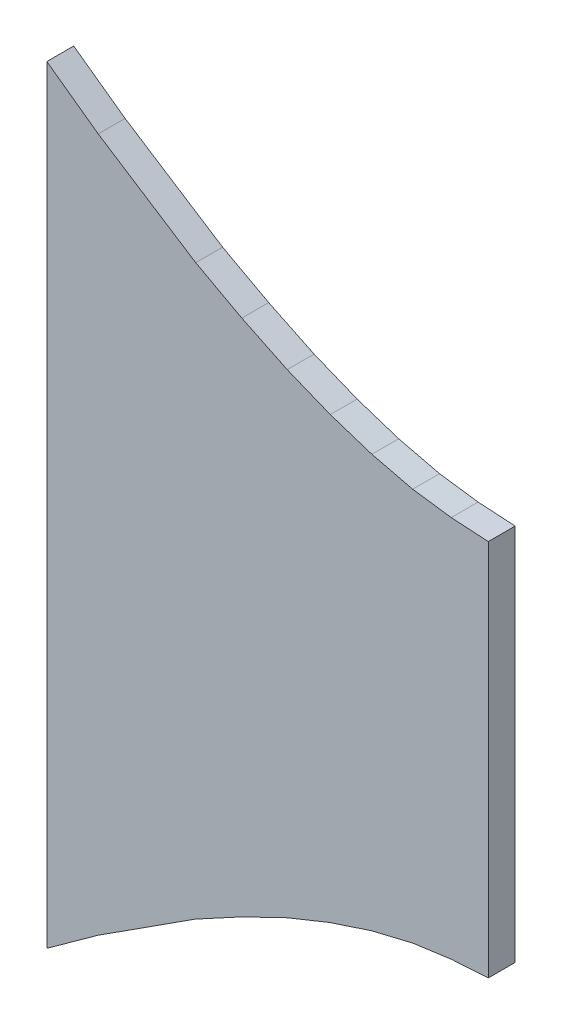
ISO-10303-21;
HEADER;
FILE_DESCRIPTION(('STEP AP214'),'2;1');
FILE_NAME('part.step','',(''),(''),'','','');
FILE_SCHEMA(('AUTOMOTIVE_DESIGN { 1 0 10303 214 1 1 1 1 }'));
ENDSEC;
DATA;
#1=APPLICATION_CONTEXT('core data for automotive mechanical design processes');
#2=APPLICATION_PROTOCOL_DEFINITION('international standard','automotive_design',2000,#1);
#3=PRODUCT_CONTEXT('',#1,'mechanical');
#4=PRODUCT('Part','Part','',(#3));
#5=PRODUCT_RELATED_PRODUCT_CATEGORY('part','',(#4));
#6=PRODUCT_DEFINITION_FORMATION('','',#4);
#7=PRODUCT_DEFINITION_CONTEXT('part definition',#1,'design');
#8=PRODUCT_DEFINITION('design','',#6,#7);
#9=PRODUCT_DEFINITION_SHAPE('','',#8);
#10=(LENGTH_UNIT() NAMED_UNIT(*) SI_UNIT(.MILLI.,.METRE.));
#11=(NAMED_UNIT(*) PLANE_ANGLE_UNIT() SI_UNIT($,.RADIAN.));
#12=(NAMED_UNIT(*) SI_UNIT($,.STERADIAN.) SOLID_ANGLE_UNIT());
#13=UNCERTAINTY_MEASURE_WITH_UNIT(LENGTH_MEASURE(1.E-05),#10,'distance_accuracy_value','');
#14=(GEOMETRIC_REPRESENTATION_CONTEXT(3) GLOBAL_UNCERTAINTY_ASSIGNED_CONTEXT((#13)) GLOBAL_UNIT_ASSIGNED_CONTEXT((#10,
#11,#12)) REPRESENTATION_CONTEXT('',''));
#15=CARTESIAN_POINT('',(0.,0.,0.));
#16=DIRECTION('',(0.,0.,1.));
#17=DIRECTION('',(1.,0.,0.));
#18=AXIS2_PLACEMENT_3D('',#15,#16,#17);
#19=CARTESIAN_POINT('',(54.8650016784668,71.75,0.));
#20=DIRECTION('',(-0.0610768850575718,-0.998133064331437,0.));
#21=DIRECTION('',(-0.998133064331437,0.0610768850575718,0.));
#22=AXIS2_PLACEMENT_3D('',#19,#20,#21);
#23=PLANE('',#22);
#24=DIRECTION('',(-0.998133064331437,0.0610768850575718,0.));
#25=VECTOR('',#24,1.);
#26=CARTESIAN_POINT('',(54.8650016784668,71.75,0.03556));
#27=LINE('',#26,#25);
#28=CARTESIAN_POINT('',(54.8650016784668,71.75,0.03556));
#29=VERTEX_POINT('',#28);
#30=CARTESIAN_POINT('',(54.8160018920898,71.7529983520508,0.03556));
#31=VERTEX_POINT('',#30);
#32=EDGE_CURVE('E11',#29,#31,#27,.T.);
#33=ORIENTED_EDGE('',*,*,#32,.F.);
#34=DIRECTION('',(0.,0.,1.));
#35=VECTOR('',#34,1.);
#36=CARTESIAN_POINT('',(54.8650016784668,71.75,0.));
#37=LINE('',#36,#35);
#38=CARTESIAN_POINT('',(54.8650016784668,71.75,0.));
#39=VERTEX_POINT('',#38);
#40=EDGE_CURVE('E24',#39,#29,#37,.T.);
#41=ORIENTED_EDGE('',*,*,#40,.F.);
#42=DIRECTION('',(-0.998133064331437,0.0610768850575718,0.));
#43=VECTOR('',#42,1.);
#44=CARTESIAN_POINT('',(54.8650016784668,71.75,0.));
#45=LINE('',#44,#43);
#46=CARTESIAN_POINT('',(54.8160018920898,71.7529983520508,0.));
#47=VERTEX_POINT('',#46);
#48=EDGE_CURVE('E172',#39,#47,#45,.T.);
#49=ORIENTED_EDGE('',*,*,#48,.T.);
#50=DIRECTION('',(0.,0.,1.));
#51=VECTOR('',#50,1.);
#52=CARTESIAN_POINT('',(54.8160018920898,71.7529983520508,0.));
#53=LINE('',#52,#51);
#54=EDGE_CURVE('E37',#47,#31,#53,.T.);
#55=ORIENTED_EDGE('',*,*,#54,.T.);
#56=EDGE_LOOP('',(#33,#41,#49,#55));
#57=FACE_BOUND('',#56,.T.);
#58=ADVANCED_FACE('F17',(#57),#23,.F.);
#59=CARTESIAN_POINT('',(54.8160018920898,71.7529983520508,0.));
#60=DIRECTION('',(-0.136045618948407,-0.990702573714707,0.));
#61=DIRECTION('',(-0.990702573714707,0.136045618948407,0.));
#62=AXIS2_PLACEMENT_3D('',#59,#60,#61);
#63=PLANE('',#62);
#64=DIRECTION('',(-0.990702573714707,0.136045618948407,0.));
#65=VECTOR('',#64,1.);
#66=CARTESIAN_POINT('',(54.8160018920898,71.7529983520508,0.03556));
#67=LINE('',#66,#65);
#68=CARTESIAN_POINT('',(54.7649993896484,71.7600021362305,0.03556));
#69=VERTEX_POINT('',#68);
#70=EDGE_CURVE('E308',#31,#69,#67,.T.);
#71=ORIENTED_EDGE('',*,*,#70,.F.);
#72=ORIENTED_EDGE('',*,*,#54,.F.);
#73=DIRECTION('',(-0.990702573714707,0.136045618948407,0.));
#74=VECTOR('',#73,1.);
#75=CARTESIAN_POINT('',(54.8160018920898,71.7529983520508,0.));
#76=LINE('',#75,#74);
#77=CARTESIAN_POINT('',(54.7649993896484,71.7600021362305,0.));
#78=VERTEX_POINT('',#77);
#79=EDGE_CURVE('E305',#47,#78,#76,.T.);
#80=ORIENTED_EDGE('',*,*,#79,.T.);
#81=DIRECTION('',(0.,0.,1.));
#82=VECTOR('',#81,1.);
#83=CARTESIAN_POINT('',(54.7649993896484,71.7600021362305,0.));
#84=LINE('',#83,#82);
#85=EDGE_CURVE('E303',#78,#69,#84,.T.);
#86=ORIENTED_EDGE('',*,*,#85,.T.);
#87=EDGE_LOOP('',(#71,#72,#80,#86));
#88=FACE_BOUND('',#87,.T.);
#89=ADVANCED_FACE('F316',(#88),#63,.F.);
#90=CARTESIAN_POINT('',(54.7649993896484,71.7600021362305,0.));
#91=DIRECTION('',(-0.234058647227909,-0.972222479506538,0.));
#92=DIRECTION('',(-0.972222479506538,0.234058647227909,0.));
#93=AXIS2_PLACEMENT_3D('',#90,#91,#92);
#94=PLANE('',#93);
#95=DIRECTION('',(-0.972222479506538,0.234058647227909,0.));
#96=VECTOR('',#95,1.);
#97=CARTESIAN_POINT('',(54.7649993896484,71.7600021362305,0.03556));
#98=LINE('',#97,#96);
#99=CARTESIAN_POINT('',(54.7109985351562,71.7730026245117,0.03556));
#100=VERTEX_POINT('',#99);
#101=EDGE_CURVE('E300',#69,#100,#98,.T.);
#102=ORIENTED_EDGE('',*,*,#101,.F.);
#103=ORIENTED_EDGE('',*,*,#85,.F.);
#104=DIRECTION('',(-0.972222479506538,0.234058647227909,0.));
#105=VECTOR('',#104,1.);
#106=CARTESIAN_POINT('',(54.7649993896484,71.7600021362305,0.));
#107=LINE('',#106,#105);
#108=CARTESIAN_POINT('',(54.7109985351562,71.7730026245117,0.));
#109=VERTEX_POINT('',#108);
#110=EDGE_CURVE('E297',#78,#109,#107,.T.);
#111=ORIENTED_EDGE('',*,*,#110,.T.);
#112=DIRECTION('',(0.,0.,1.));
#113=VECTOR('',#112,1.);
#114=CARTESIAN_POINT('',(54.7109985351562,71.7730026245117,0.));
#115=LINE('',#114,#113);
#116=EDGE_CURVE('E295',#109,#100,#115,.T.);
#117=ORIENTED_EDGE('',*,*,#116,.T.);
#118=EDGE_LOOP('',(#102,#103,#111,#117));
#119=FACE_BOUND('',#118,.T.);
#120=ADVANCED_FACE('F322',(#119),#94,.F.);
#121=CARTESIAN_POINT('',(54.7109985351562,71.7730026245117,0.));
#122=DIRECTION('',(-0.311002253042668,-0.950409174304617,0.));
#123=DIRECTION('',(-0.950409174304617,0.311002253042668,0.));
#124=AXIS2_PLACEMENT_3D('',#121,#122,#123);
#125=PLANE('',#124);
#126=DIRECTION('',(-0.950409174304617,0.311002253042668,0.));
#127=VECTOR('',#126,1.);
#128=CARTESIAN_POINT('',(54.7109985351562,71.7730026245117,0.03556));
#129=LINE('',#128,#127);
#130=CARTESIAN_POINT('',(54.6559982299805,71.7910003662109,0.03556));
#131=VERTEX_POINT('',#130);
#132=EDGE_CURVE('E292',#100,#131,#129,.T.);
#133=ORIENTED_EDGE('',*,*,#132,.F.);
#134=ORIENTED_EDGE('',*,*,#116,.F.);
#135=DIRECTION('',(-0.950409174304617,0.311002253042668,0.));
#136=VECTOR('',#135,1.);
#137=CARTESIAN_POINT('',(54.7109985351562,71.7730026245117,0.));
#138=LINE('',#137,#136);
#139=CARTESIAN_POINT('',(54.6559982299805,71.7910003662109,0.));
#140=VERTEX_POINT('',#139);
#141=EDGE_CURVE('E289',#109,#140,#138,.T.);
#142=ORIENTED_EDGE('',*,*,#141,.T.);
#143=DIRECTION('',(0.,0.,1.));
#144=VECTOR('',#143,1.);
#145=CARTESIAN_POINT('',(54.6559982299805,71.7910003662109,0.));
#146=LINE('',#145,#144);
#147=EDGE_CURVE('E287',#140,#131,#146,.T.);
#148=ORIENTED_EDGE('',*,*,#147,.T.);
#149=EDGE_LOOP('',(#133,#134,#142,#148));
#150=FACE_BOUND('',#149,.T.);
#151=ADVANCED_FACE('F324',(#150),#125,.F.);
#152=CARTESIAN_POINT('',(54.6559982299805,71.7910003662109,0.));
#153=DIRECTION('',(-0.374235233417141,-0.927333807250236,0.));
#154=DIRECTION('',(-0.927333807250236,0.374235233417141,0.));
#155=AXIS2_PLACEMENT_3D('',#152,#153,#154);
#156=PLANE('',#155);
#157=DIRECTION('',(-0.927333807250236,0.374235233417141,0.));
#158=VECTOR('',#157,1.);
#159=CARTESIAN_POINT('',(54.6559982299805,71.7910003662109,0.03556));
#160=LINE('',#159,#158);
#161=CARTESIAN_POINT('',(54.5989990234375,71.8140029907227,0.03556));
#162=VERTEX_POINT('',#161);
#163=EDGE_CURVE('E284',#131,#162,#160,.T.);
#164=ORIENTED_EDGE('',*,*,#163,.F.);
#165=ORIENTED_EDGE('',*,*,#147,.F.);
#166=DIRECTION('',(-0.927333807250236,0.374235233417141,0.));
#167=VECTOR('',#166,1.);
#168=CARTESIAN_POINT('',(54.6559982299805,71.7910003662109,0.));
#169=LINE('',#168,#167);
#170=CARTESIAN_POINT('',(54.5989990234375,71.8140029907227,0.));
#171=VERTEX_POINT('',#170);
#172=EDGE_CURVE('E281',#140,#171,#169,.T.);
#173=ORIENTED_EDGE('',*,*,#172,.T.);
#174=DIRECTION('',(0.,0.,1.));
#175=VECTOR('',#174,1.);
#176=CARTESIAN_POINT('',(54.5989990234375,71.8140029907227,0.));
#177=LINE('',#176,#175);
#178=EDGE_CURVE('E279',#171,#162,#177,.T.);
#179=ORIENTED_EDGE('',*,*,#178,.T.);
#180=EDGE_LOOP('',(#164,#165,#173,#179));
#181=FACE_BOUND('',#180,.T.);
#182=ADVANCED_FACE('F329',(#181),#156,.F.);
#183=CARTESIAN_POINT('',(54.5989990234375,71.8140029907227,0.));
#184=DIRECTION('',(-0.435174847761771,-0.900345962325327,0.));
#185=DIRECTION('',(-0.900345962325327,0.435174847761771,0.));
#186=AXIS2_PLACEMENT_3D('',#183,#184,#185);
#187=PLANE('',#186);
#188=DIRECTION('',(-0.900345962325327,0.435174847761771,0.));
#189=VECTOR('',#188,1.);
#190=CARTESIAN_POINT('',(54.5989990234375,71.8140029907227,0.03556));
#191=LINE('',#190,#189);
#192=CARTESIAN_POINT('',(54.5390014648438,71.8430023193359,0.03556));
#193=VERTEX_POINT('',#192);
#194=EDGE_CURVE('E276',#162,#193,#191,.T.);
#195=ORIENTED_EDGE('',*,*,#194,.F.);
#196=ORIENTED_EDGE('',*,*,#178,.F.);
#197=DIRECTION('',(-0.900345962325327,0.435174847761771,0.));
#198=VECTOR('',#197,1.);
#199=CARTESIAN_POINT('',(54.5989990234375,71.8140029907227,0.));
#200=LINE('',#199,#198);
#201=CARTESIAN_POINT('',(54.5390014648438,71.8430023193359,0.));
#202=VERTEX_POINT('',#201);
#203=EDGE_CURVE('E273',#171,#202,#200,.T.);
#204=ORIENTED_EDGE('',*,*,#203,.T.);
#205=DIRECTION('',(0.,0.,1.));
#206=VECTOR('',#205,1.);
#207=CARTESIAN_POINT('',(54.5390014648438,71.8430023193359,0.));
#208=LINE('',#207,#206);
#209=EDGE_CURVE('E271',#202,#193,#208,.T.);
#210=ORIENTED_EDGE('',*,*,#209,.T.);
#211=EDGE_LOOP('',(#195,#196,#204,#210));
#212=FACE_BOUND('',#211,.T.);
#213=ADVANCED_FACE('F332',(#212),#187,.F.);
#214=CARTESIAN_POINT('',(54.5390014648438,71.8430023193359,0.));
#215=DIRECTION('',(-0.475781614948567,-0.879563445623415,0.));
#216=DIRECTION('',(-0.879563445623415,0.475781614948567,0.));
#217=AXIS2_PLACEMENT_3D('',#214,#215,#216);
#218=PLANE('',#217);
#219=DIRECTION('',(-0.879563445623415,0.475781614948567,0.));
#220=VECTOR('',#219,1.);
#221=CARTESIAN_POINT('',(54.5390014648438,71.8430023193359,0.03556));
#222=LINE('',#221,#220);
#223=CARTESIAN_POINT('',(54.4780006408691,71.8759994506836,0.03556));
#224=VERTEX_POINT('',#223);
#225=EDGE_CURVE('E268',#193,#224,#222,.T.);
#226=ORIENTED_EDGE('',*,*,#225,.F.);
#227=ORIENTED_EDGE('',*,*,#209,.F.);
#228=DIRECTION('',(-0.879563445623415,0.475781614948567,0.));
#229=VECTOR('',#228,1.);
#230=CARTESIAN_POINT('',(54.5390014648438,71.8430023193359,0.));
#231=LINE('',#230,#229);
#232=CARTESIAN_POINT('',(54.4780006408691,71.8759994506836,0.));
#233=VERTEX_POINT('',#232);
#234=EDGE_CURVE('E265',#202,#233,#231,.T.);
#235=ORIENTED_EDGE('',*,*,#234,.T.);
#236=DIRECTION('',(0.,0.,1.));
#237=VECTOR('',#236,1.);
#238=CARTESIAN_POINT('',(54.4780006408691,71.8759994506836,0.));
#239=LINE('',#238,#237);
#240=EDGE_CURVE('E263',#233,#224,#239,.T.);
#241=ORIENTED_EDGE('',*,*,#240,.T.);
#242=EDGE_LOOP('',(#226,#227,#235,#241));
#243=FACE_BOUND('',#242,.T.);
#244=ADVANCED_FACE('F337',(#243),#218,.F.);
#245=CARTESIAN_POINT('',(54.4780006408691,71.8759994506836,0.));
#246=DIRECTION('',(-0.541083082315967,-0.84096914213986,0.));
#247=DIRECTION('',(-0.84096914213986,0.541083082315967,0.));
#248=AXIS2_PLACEMENT_3D('',#245,#246,#247);
#249=PLANE('',#248);
#250=DIRECTION('',(-0.84096914213986,0.541083082315967,0.));
#251=VECTOR('',#250,1.);
#252=CARTESIAN_POINT('',(54.4780006408691,71.8759994506836,0.03556));
#253=LINE('',#252,#251);
#254=CARTESIAN_POINT('',(54.3489990234375,71.9589996337891,0.03556));
#255=VERTEX_POINT('',#254);
#256=EDGE_CURVE('E260',#224,#255,#253,.T.);
#257=ORIENTED_EDGE('',*,*,#256,.F.);
#258=ORIENTED_EDGE('',*,*,#240,.F.);
#259=DIRECTION('',(-0.84096914213986,0.541083082315967,0.));
#260=VECTOR('',#259,1.);
#261=CARTESIAN_POINT('',(54.4780006408691,71.8759994506836,0.));
#262=LINE('',#261,#260);
#263=CARTESIAN_POINT('',(54.3489990234375,71.9589996337891,0.));
#264=VERTEX_POINT('',#263);
#265=EDGE_CURVE('E257',#233,#264,#262,.T.);
#266=ORIENTED_EDGE('',*,*,#265,.T.);
#267=DIRECTION('',(0.,0.,1.));
#268=VECTOR('',#267,1.);
#269=CARTESIAN_POINT('',(54.3489990234375,71.9589996337891,0.));
#270=LINE('',#269,#268);
#271=EDGE_CURVE('E255',#264,#255,#270,.T.);
#272=ORIENTED_EDGE('',*,*,#271,.T.);
#273=EDGE_LOOP('',(#257,#258,#266,#272));
#274=FACE_BOUND('',#273,.T.);
#275=ADVANCED_FACE('F340',(#274),#249,.F.);
#276=CARTESIAN_POINT('',(54.3489990234375,71.9589996337891,0.));
#277=DIRECTION('',(-0.584642775450006,-0.811290838795875,0.));
#278=DIRECTION('',(-0.811290838795875,0.584642775450006,0.));
#279=AXIS2_PLACEMENT_3D('',#276,#277,#278);
#280=PLANE('',#279);
#281=DIRECTION('',(-0.811290838795875,0.584642775450006,0.));
#282=VECTOR('',#281,1.);
#283=CARTESIAN_POINT('',(54.3489990234375,71.9589996337891,0.03556));
#284=LINE('',#283,#282);
#285=CARTESIAN_POINT('',(54.2809982299805,72.0080032348633,0.03556));
#286=VERTEX_POINT('',#285);
#287=EDGE_CURVE('E252',#255,#286,#284,.T.);
#288=ORIENTED_EDGE('',*,*,#287,.F.);
#289=ORIENTED_EDGE('',*,*,#271,.F.);
#290=DIRECTION('',(-0.811290838795875,0.584642775450006,0.));
#291=VECTOR('',#290,1.);
#292=CARTESIAN_POINT('',(54.3489990234375,71.9589996337891,0.));
#293=LINE('',#292,#291);
#294=CARTESIAN_POINT('',(54.2809982299805,72.0080032348633,0.));
#295=VERTEX_POINT('',#294);
#296=EDGE_CURVE('E249',#264,#295,#293,.T.);
#297=ORIENTED_EDGE('',*,*,#296,.T.);
#298=DIRECTION('',(0.,0.,1.));
#299=VECTOR('',#298,1.);
#300=CARTESIAN_POINT('',(54.2809982299805,72.0080032348633,0.));
#301=LINE('',#300,#299);
#302=EDGE_CURVE('E247',#295,#286,#301,.T.);
#303=ORIENTED_EDGE('',*,*,#302,.T.);
#304=EDGE_LOOP('',(#288,#289,#297,#303));
#305=FACE_BOUND('',#304,.T.);
#306=ADVANCED_FACE('F345',(#305),#280,.F.);
#307=CARTESIAN_POINT('',(54.2809982299805,72.0080032348633,0.));
#308=DIRECTION('',(1.,0.,0.));
#309=DIRECTION('',(0.,-1.,0.));
#310=AXIS2_PLACEMENT_3D('',#307,#308,#309);
#311=PLANE('',#310);
#312=DIRECTION('',(0.,-1.,0.));
#313=VECTOR('',#312,1.);
#314=CARTESIAN_POINT('',(54.2809982299805,72.0080032348633,0.03556));
#315=LINE('',#314,#313);
#316=CARTESIAN_POINT('',(54.2809982299805,70.9919967651367,0.03556));
#317=VERTEX_POINT('',#316);
#318=EDGE_CURVE('E244',#286,#317,#315,.T.);
#319=ORIENTED_EDGE('',*,*,#318,.F.);
#320=ORIENTED_EDGE('',*,*,#302,.F.);
#321=DIRECTION('',(0.,-1.,0.));
#322=VECTOR('',#321,1.);
#323=CARTESIAN_POINT('',(54.2809982299805,72.0080032348633,0.));
#324=LINE('',#323,#322);
#325=CARTESIAN_POINT('',(54.2809982299805,70.9919967651367,0.));
#326=VERTEX_POINT('',#325);
#327=EDGE_CURVE('E241',#295,#326,#324,.T.);
#328=ORIENTED_EDGE('',*,*,#327,.T.);
#329=DIRECTION('',(0.,0.,1.));
#330=VECTOR('',#329,1.);
#331=CARTESIAN_POINT('',(54.2809982299805,70.9919967651367,0.));
#332=LINE('',#331,#330);
#333=EDGE_CURVE('E239',#326,#317,#332,.T.);
#334=ORIENTED_EDGE('',*,*,#333,.T.);
#335=EDGE_LOOP('',(#319,#320,#328,#334));
#336=FACE_BOUND('',#335,.T.);
#337=ADVANCED_FACE('F348',(#336),#311,.F.);
#338=CARTESIAN_POINT('',(54.2809982299805,70.9919967651367,0.));
#339=DIRECTION('',(-0.584642775450006,0.811290838795875,0.));
#340=DIRECTION('',(0.811290838795875,0.584642775450006,0.));
#341=AXIS2_PLACEMENT_3D('',#338,#339,#340);
#342=PLANE('',#341);
#343=DIRECTION('',(0.811290838795875,0.584642775450006,0.));
#344=VECTOR('',#343,1.);
#345=CARTESIAN_POINT('',(54.2809982299805,70.9919967651367,0.03556));
#346=LINE('',#345,#344);
#347=CARTESIAN_POINT('',(54.3489990234375,71.0410003662109,0.03556));
#348=VERTEX_POINT('',#347);
#349=EDGE_CURVE('E236',#317,#348,#346,.T.);
#350=ORIENTED_EDGE('',*,*,#349,.F.);
#351=ORIENTED_EDGE('',*,*,#333,.F.);
#352=DIRECTION('',(0.811290838795875,0.584642775450006,0.));
#353=VECTOR('',#352,1.);
#354=CARTESIAN_POINT('',(54.2809982299805,70.9919967651367,0.));
#355=LINE('',#354,#353);
#356=CARTESIAN_POINT('',(54.3489990234375,71.0410003662109,0.));
#357=VERTEX_POINT('',#356);
#358=EDGE_CURVE('E233',#326,#357,#355,.T.);
#359=ORIENTED_EDGE('',*,*,#358,.T.);
#360=DIRECTION('',(0.,0.,1.));
#361=VECTOR('',#360,1.);
#362=CARTESIAN_POINT('',(54.3489990234375,71.0410003662109,0.));
#363=LINE('',#362,#361);
#364=EDGE_CURVE('E231',#357,#348,#363,.T.);
#365=ORIENTED_EDGE('',*,*,#364,.T.);
#366=EDGE_LOOP('',(#350,#351,#359,#365));
#367=FACE_BOUND('',#366,.T.);
#368=ADVANCED_FACE('F353',(#367),#342,.F.);
#369=CARTESIAN_POINT('',(54.3489990234375,71.0410003662109,0.));
#370=DIRECTION('',(-0.541083082315967,0.84096914213986,0.));
#371=DIRECTION('',(0.84096914213986,0.541083082315967,0.));
#372=AXIS2_PLACEMENT_3D('',#369,#370,#371);
#373=PLANE('',#372);
#374=DIRECTION('',(0.84096914213986,0.541083082315967,0.));
#375=VECTOR('',#374,1.);
#376=CARTESIAN_POINT('',(54.3489990234375,71.0410003662109,0.03556));
#377=LINE('',#376,#375);
#378=CARTESIAN_POINT('',(54.4780006408691,71.1240005493164,0.03556));
#379=VERTEX_POINT('',#378);
#380=EDGE_CURVE('E228',#348,#379,#377,.T.);
#381=ORIENTED_EDGE('',*,*,#380,.F.);
#382=ORIENTED_EDGE('',*,*,#364,.F.);
#383=DIRECTION('',(0.84096914213986,0.541083082315967,0.));
#384=VECTOR('',#383,1.);
#385=CARTESIAN_POINT('',(54.3489990234375,71.0410003662109,0.));
#386=LINE('',#385,#384);
#387=CARTESIAN_POINT('',(54.4780006408691,71.1240005493164,0.));
#388=VERTEX_POINT('',#387);
#389=EDGE_CURVE('E225',#357,#388,#386,.T.);
#390=ORIENTED_EDGE('',*,*,#389,.T.);
#391=DIRECTION('',(0.,0.,1.));
#392=VECTOR('',#391,1.);
#393=CARTESIAN_POINT('',(54.4780006408691,71.1240005493164,0.));
#394=LINE('',#393,#392);
#395=EDGE_CURVE('E223',#388,#379,#394,.T.);
#396=ORIENTED_EDGE('',*,*,#395,.T.);
#397=EDGE_LOOP('',(#381,#382,#390,#396));
#398=FACE_BOUND('',#397,.T.);
#399=ADVANCED_FACE('F356',(#398),#373,.F.);
#400=CARTESIAN_POINT('',(54.4780006408691,71.1240005493164,0.));
#401=DIRECTION('',(-0.475781614948567,0.879563445623415,0.));
#402=DIRECTION('',(0.879563445623415,0.475781614948567,0.));
#403=AXIS2_PLACEMENT_3D('',#400,#401,#402);
#404=PLANE('',#403);
#405=DIRECTION('',(0.879563445623415,0.475781614948567,0.));
#406=VECTOR('',#405,1.);
#407=CARTESIAN_POINT('',(54.4780006408691,71.1240005493164,0.03556));
#408=LINE('',#407,#406);
#409=CARTESIAN_POINT('',(54.5390014648438,71.1569976806641,0.03556));
#410=VERTEX_POINT('',#409);
#411=EDGE_CURVE('E220',#379,#410,#408,.T.);
#412=ORIENTED_EDGE('',*,*,#411,.F.);
#413=ORIENTED_EDGE('',*,*,#395,.F.);
#414=DIRECTION('',(0.879563445623415,0.475781614948567,0.));
#415=VECTOR('',#414,1.);
#416=CARTESIAN_POINT('',(54.4780006408691,71.1240005493164,0.));
#417=LINE('',#416,#415);
#418=CARTESIAN_POINT('',(54.5390014648438,71.1569976806641,0.));
#419=VERTEX_POINT('',#418);
#420=EDGE_CURVE('E217',#388,#419,#417,.T.);
#421=ORIENTED_EDGE('',*,*,#420,.T.);
#422=DIRECTION('',(0.,0.,1.));
#423=VECTOR('',#422,1.);
#424=CARTESIAN_POINT('',(54.5390014648438,71.1569976806641,0.));
#425=LINE('',#424,#423);
#426=EDGE_CURVE('E215',#419,#410,#425,.T.);
#427=ORIENTED_EDGE('',*,*,#426,.T.);
#428=EDGE_LOOP('',(#412,#413,#421,#427));
#429=FACE_BOUND('',#428,.T.);
#430=ADVANCED_FACE('F361',(#429),#404,.F.);
#431=CARTESIAN_POINT('',(54.5390014648438,71.1569976806641,0.));
#432=DIRECTION('',(-0.435174847761771,0.900345962325327,0.));
#433=DIRECTION('',(0.900345962325327,0.435174847761771,0.));
#434=AXIS2_PLACEMENT_3D('',#431,#432,#433);
#435=PLANE('',#434);
#436=DIRECTION('',(0.900345962325327,0.435174847761771,0.));
#437=VECTOR('',#436,1.);
#438=CARTESIAN_POINT('',(54.5390014648438,71.1569976806641,0.03556));
#439=LINE('',#438,#437);
#440=CARTESIAN_POINT('',(54.5989990234375,71.1859970092773,0.03556));
#441=VERTEX_POINT('',#440);
#442=EDGE_CURVE('E212',#410,#441,#439,.T.);
#443=ORIENTED_EDGE('',*,*,#442,.F.);
#444=ORIENTED_EDGE('',*,*,#426,.F.);
#445=DIRECTION('',(0.900345962325327,0.435174847761771,0.));
#446=VECTOR('',#445,1.);
#447=CARTESIAN_POINT('',(54.5390014648438,71.1569976806641,0.));
#448=LINE('',#447,#446);
#449=CARTESIAN_POINT('',(54.5989990234375,71.1859970092773,0.));
#450=VERTEX_POINT('',#449);
#451=EDGE_CURVE('E209',#419,#450,#448,.T.);
#452=ORIENTED_EDGE('',*,*,#451,.T.);
#453=DIRECTION('',(0.,0.,1.));
#454=VECTOR('',#453,1.);
#455=CARTESIAN_POINT('',(54.5989990234375,71.1859970092773,0.));
#456=LINE('',#455,#454);
#457=EDGE_CURVE('E207',#450,#441,#456,.T.);
#458=ORIENTED_EDGE('',*,*,#457,.T.);
#459=EDGE_LOOP('',(#443,#444,#452,#458));
#460=FACE_BOUND('',#459,.T.);
#461=ADVANCED_FACE('F364',(#460),#435,.F.);
#462=CARTESIAN_POINT('',(54.5989990234375,71.1859970092773,0.));
#463=DIRECTION('',(-0.374235233417141,0.927333807250236,0.));
#464=DIRECTION('',(0.927333807250236,0.374235233417141,0.));
#465=AXIS2_PLACEMENT_3D('',#462,#463,#464);
#466=PLANE('',#465);
#467=DIRECTION('',(0.927333807250236,0.374235233417141,0.));
#468=VECTOR('',#467,1.);
#469=CARTESIAN_POINT('',(54.5989990234375,71.1859970092773,0.03556));
#470=LINE('',#469,#468);
#471=CARTESIAN_POINT('',(54.6559982299805,71.2089996337891,0.03556));
#472=VERTEX_POINT('',#471);
#473=EDGE_CURVE('E204',#441,#472,#470,.T.);
#474=ORIENTED_EDGE('',*,*,#473,.F.);
#475=ORIENTED_EDGE('',*,*,#457,.F.);
#476=DIRECTION('',(0.927333807250236,0.374235233417141,0.));
#477=VECTOR('',#476,1.);
#478=CARTESIAN_POINT('',(54.5989990234375,71.1859970092773,0.));
#479=LINE('',#478,#477);
#480=CARTESIAN_POINT('',(54.6559982299805,71.2089996337891,0.));
#481=VERTEX_POINT('',#480);
#482=EDGE_CURVE('E201',#450,#481,#479,.T.);
#483=ORIENTED_EDGE('',*,*,#482,.T.);
#484=DIRECTION('',(0.,0.,1.));
#485=VECTOR('',#484,1.);
#486=CARTESIAN_POINT('',(54.6559982299805,71.2089996337891,0.));
#487=LINE('',#486,#485);
#488=EDGE_CURVE('E199',#481,#472,#487,.T.);
#489=ORIENTED_EDGE('',*,*,#488,.T.);
#490=EDGE_LOOP('',(#474,#475,#483,#489));
#491=FACE_BOUND('',#490,.T.);
#492=ADVANCED_FACE('F369',(#491),#466,.F.);
#493=CARTESIAN_POINT('',(54.6559982299805,71.2089996337891,0.));
#494=DIRECTION('',(-0.311002253042668,0.950409174304617,0.));
#495=DIRECTION('',(0.950409174304617,0.311002253042668,0.));
#496=AXIS2_PLACEMENT_3D('',#493,#494,#495);
#497=PLANE('',#496);
#498=DIRECTION('',(0.950409174304617,0.311002253042668,0.));
#499=VECTOR('',#498,1.);
#500=CARTESIAN_POINT('',(54.6559982299805,71.2089996337891,0.03556));
#501=LINE('',#500,#499);
#502=CARTESIAN_POINT('',(54.7109985351562,71.2269973754883,0.03556));
#503=VERTEX_POINT('',#502);
#504=EDGE_CURVE('E196',#472,#503,#501,.T.);
#505=ORIENTED_EDGE('',*,*,#504,.F.);
#506=ORIENTED_EDGE('',*,*,#488,.F.);
#507=DIRECTION('',(0.950409174304617,0.311002253042668,0.));
#508=VECTOR('',#507,1.);
#509=CARTESIAN_POINT('',(54.6559982299805,71.2089996337891,0.));
#510=LINE('',#509,#508);
#511=CARTESIAN_POINT('',(54.7109985351562,71.2269973754883,0.));
#512=VERTEX_POINT('',#511);
#513=EDGE_CURVE('E193',#481,#512,#510,.T.);
#514=ORIENTED_EDGE('',*,*,#513,.T.);
#515=DIRECTION('',(0.,0.,1.));
#516=VECTOR('',#515,1.);
#517=CARTESIAN_POINT('',(54.7109985351562,71.2269973754883,0.));
#518=LINE('',#517,#516);
#519=EDGE_CURVE('E191',#512,#503,#518,.T.);
#520=ORIENTED_EDGE('',*,*,#519,.T.);
#521=EDGE_LOOP('',(#505,#506,#514,#520));
#522=FACE_BOUND('',#521,.T.);
#523=ADVANCED_FACE('F372',(#522),#497,.F.);
#524=CARTESIAN_POINT('',(54.7109985351562,71.2269973754883,0.));
#525=DIRECTION('',(-0.234058647227909,0.972222479506538,0.));
#526=DIRECTION('',(0.972222479506538,0.234058647227909,0.));
#527=AXIS2_PLACEMENT_3D('',#524,#525,#526);
#528=PLANE('',#527);
#529=DIRECTION('',(0.972222479506538,0.234058647227909,0.));
#530=VECTOR('',#529,1.);
#531=CARTESIAN_POINT('',(54.7109985351562,71.2269973754883,0.03556));
#532=LINE('',#531,#530);
#533=CARTESIAN_POINT('',(54.7649993896484,71.2399978637695,0.03556));
#534=VERTEX_POINT('',#533);
#535=EDGE_CURVE('E188',#503,#534,#532,.T.);
#536=ORIENTED_EDGE('',*,*,#535,.F.);
#537=ORIENTED_EDGE('',*,*,#519,.F.);
#538=DIRECTION('',(0.972222479506538,0.234058647227909,0.));
#539=VECTOR('',#538,1.);
#540=CARTESIAN_POINT('',(54.7109985351562,71.2269973754883,0.));
#541=LINE('',#540,#539);
#542=CARTESIAN_POINT('',(54.7649993896484,71.2399978637695,0.));
#543=VERTEX_POINT('',#542);
#544=EDGE_CURVE('E185',#512,#543,#541,.T.);
#545=ORIENTED_EDGE('',*,*,#544,.T.);
#546=DIRECTION('',(0.,0.,1.));
#547=VECTOR('',#546,1.);
#548=CARTESIAN_POINT('',(54.7649993896484,71.2399978637695,0.));
#549=LINE('',#548,#547);
#550=EDGE_CURVE('E183',#543,#534,#549,.T.);
#551=ORIENTED_EDGE('',*,*,#550,.T.);
#552=EDGE_LOOP('',(#536,#537,#545,#551));
#553=FACE_BOUND('',#552,.T.);
#554=ADVANCED_FACE('F377',(#553),#528,.F.);
#555=CARTESIAN_POINT('',(54.7649993896484,71.2399978637695,0.));
#556=DIRECTION('',(-0.136045618948407,0.990702573714707,0.));
#557=DIRECTION('',(0.990702573714707,0.136045618948407,0.));
#558=AXIS2_PLACEMENT_3D('',#555,#556,#557);
#559=PLANE('',#558);
#560=DIRECTION('',(0.990702573714707,0.136045618948407,0.));
#561=VECTOR('',#560,1.);
#562=CARTESIAN_POINT('',(54.7649993896484,71.2399978637695,0.03556));
#563=LINE('',#562,#561);
#564=CARTESIAN_POINT('',(54.8160018920898,71.2470016479492,0.03556));
#565=VERTEX_POINT('',#564);
#566=EDGE_CURVE('E180',#534,#565,#563,.T.);
#567=ORIENTED_EDGE('',*,*,#566,.F.);
#568=ORIENTED_EDGE('',*,*,#550,.F.);
#569=DIRECTION('',(0.990702573714707,0.136045618948407,0.));
#570=VECTOR('',#569,1.);
#571=CARTESIAN_POINT('',(54.7649993896484,71.2399978637695,0.));
#572=LINE('',#571,#570);
#573=CARTESIAN_POINT('',(54.8160018920898,71.2470016479492,0.));
#574=VERTEX_POINT('',#573);
#575=EDGE_CURVE('E178',#543,#574,#572,.T.);
#576=ORIENTED_EDGE('',*,*,#575,.T.);
#577=DIRECTION('',(0.,0.,1.));
#578=VECTOR('',#577,1.);
#579=CARTESIAN_POINT('',(54.8160018920898,71.2470016479492,0.));
#580=LINE('',#579,#578);
#581=EDGE_CURVE('E163',#574,#565,#580,.T.);
#582=ORIENTED_EDGE('',*,*,#581,.T.);
#583=EDGE_LOOP('',(#567,#568,#576,#582));
#584=FACE_BOUND('',#583,.T.);
#585=ADVANCED_FACE('F379',(#584),#559,.F.);
#586=CARTESIAN_POINT('',(54.8160018920898,71.2470016479492,0.));
#587=DIRECTION('',(-0.0610768850575718,0.998133064331437,0.));
#588=DIRECTION('',(0.998133064331437,0.0610768850575718,0.));
#589=AXIS2_PLACEMENT_3D('',#586,#587,#588);
#590=PLANE('',#589);
#591=DIRECTION('',(0.998133064331437,0.0610768850575718,0.));
#592=VECTOR('',#591,1.);
#593=CARTESIAN_POINT('',(54.8160018920898,71.2470016479492,0.03556));
#594=LINE('',#593,#592);
#595=CARTESIAN_POINT('',(54.8650016784668,71.25,0.03556));
#596=VERTEX_POINT('',#595);
#597=EDGE_CURVE('E167',#565,#596,#594,.T.);
#598=ORIENTED_EDGE('',*,*,#597,.F.);
#599=ORIENTED_EDGE('',*,*,#581,.F.);
#600=DIRECTION('',(0.998133064331437,0.0610768850575718,0.));
#601=VECTOR('',#600,1.);
#602=CARTESIAN_POINT('',(54.8160018920898,71.2470016479492,0.));
#603=LINE('',#602,#601);
#604=CARTESIAN_POINT('',(54.8650016784668,71.25,0.));
#605=VERTEX_POINT('',#604);
#606=EDGE_CURVE('E159',#574,#605,#603,.T.);
#607=ORIENTED_EDGE('',*,*,#606,.T.);
#608=DIRECTION('',(0.,0.,1.));
#609=VECTOR('',#608,1.);
#610=CARTESIAN_POINT('',(54.8650016784668,71.25,0.));
#611=LINE('',#610,#609);
#612=EDGE_CURVE('E149',#605,#596,#611,.T.);
#613=ORIENTED_EDGE('',*,*,#612,.T.);
#614=EDGE_LOOP('',(#598,#599,#607,#613));
#615=FACE_BOUND('',#614,.T.);
#616=ADVANCED_FACE('F162',(#615),#590,.F.);
#617=CARTESIAN_POINT('',(54.8650016784668,71.25,0.));
#618=DIRECTION('',(-1.,0.,0.));
#619=DIRECTION('',(0.,1.,0.));
#620=AXIS2_PLACEMENT_3D('',#617,#618,#619);
#621=PLANE('',#620);
#622=DIRECTION('',(0.,1.,0.));
#623=VECTOR('',#622,1.);
#624=CARTESIAN_POINT('',(54.8650016784668,71.25,0.03556));
#625=LINE('',#624,#623);
#626=EDGE_CURVE('E155',#596,#29,#625,.T.);
#627=ORIENTED_EDGE('',*,*,#626,.F.);
#628=ORIENTED_EDGE('',*,*,#612,.F.);
#629=DIRECTION('',(0.,1.,0.));
#630=VECTOR('',#629,1.);
#631=CARTESIAN_POINT('',(54.8650016784668,71.25,0.));
#632=LINE('',#631,#630);
#633=EDGE_CURVE('E153',#605,#39,#632,.T.);
#634=ORIENTED_EDGE('',*,*,#633,.T.);
#635=ORIENTED_EDGE('',*,*,#40,.T.);
#636=EDGE_LOOP('',(#627,#628,#634,#635));
#637=FACE_BOUND('',#636,.T.);
#638=ADVANCED_FACE('F151',(#637),#621,.F.);
#639=CARTESIAN_POINT('',(54.8650016784668,71.75,0.));
#640=DIRECTION('',(0.,0.,1.));
#641=DIRECTION('',(1.,0.,0.));
#642=AXIS2_PLACEMENT_3D('',#639,#640,#641);
#643=PLANE('',#642);
#644=ORIENTED_EDGE('',*,*,#633,.F.);
#645=ORIENTED_EDGE('',*,*,#606,.F.);
#646=ORIENTED_EDGE('',*,*,#575,.F.);
#647=ORIENTED_EDGE('',*,*,#544,.F.);
#648=ORIENTED_EDGE('',*,*,#513,.F.);
#649=ORIENTED_EDGE('',*,*,#482,.F.);
#650=ORIENTED_EDGE('',*,*,#451,.F.);
#651=ORIENTED_EDGE('',*,*,#420,.F.);
#652=ORIENTED_EDGE('',*,*,#389,.F.);
#653=ORIENTED_EDGE('',*,*,#358,.F.);
#654=ORIENTED_EDGE('',*,*,#327,.F.);
#655=ORIENTED_EDGE('',*,*,#296,.F.);
#656=ORIENTED_EDGE('',*,*,#265,.F.);
#657=ORIENTED_EDGE('',*,*,#234,.F.);
#658=ORIENTED_EDGE('',*,*,#203,.F.);
#659=ORIENTED_EDGE('',*,*,#172,.F.);
#660=ORIENTED_EDGE('',*,*,#141,.F.);
#661=ORIENTED_EDGE('',*,*,#110,.F.);
#662=ORIENTED_EDGE('',*,*,#79,.F.);
#663=ORIENTED_EDGE('',*,*,#48,.F.);
#664=EDGE_LOOP('',(#644,#645,#646,#647,#648,#649,#650,#651,#652,#653,#654,#655,#656,#657,#658,
#659,#660,#661,#662,#663));
#665=FACE_BOUND('',#664,.T.);
#666=ADVANCED_FACE('F170',(#665),#643,.F.);
#667=CARTESIAN_POINT('',(54.8650016784668,71.75,0.03556));
#668=DIRECTION('',(0.,0.,1.));
#669=DIRECTION('',(1.,0.,0.));
#670=AXIS2_PLACEMENT_3D('',#667,#668,#669);
#671=PLANE('',#670);
#672=ORIENTED_EDGE('',*,*,#32,.T.);
#673=ORIENTED_EDGE('',*,*,#70,.T.);
#674=ORIENTED_EDGE('',*,*,#101,.T.);
#675=ORIENTED_EDGE('',*,*,#132,.T.);
#676=ORIENTED_EDGE('',*,*,#163,.T.);
#677=ORIENTED_EDGE('',*,*,#194,.T.);
#678=ORIENTED_EDGE('',*,*,#225,.T.);
#679=ORIENTED_EDGE('',*,*,#256,.T.);
#680=ORIENTED_EDGE('',*,*,#287,.T.);
#681=ORIENTED_EDGE('',*,*,#318,.T.);
#682=ORIENTED_EDGE('',*,*,#349,.T.);
#683=ORIENTED_EDGE('',*,*,#380,.T.);
#684=ORIENTED_EDGE('',*,*,#411,.T.);
#685=ORIENTED_EDGE('',*,*,#442,.T.);
#686=ORIENTED_EDGE('',*,*,#473,.T.);
#687=ORIENTED_EDGE('',*,*,#504,.T.);
#688=ORIENTED_EDGE('',*,*,#535,.T.);
#689=ORIENTED_EDGE('',*,*,#566,.T.);
#690=ORIENTED_EDGE('',*,*,#597,.T.);
#691=ORIENTED_EDGE('',*,*,#626,.T.);
#692=EDGE_LOOP('',(#672,#673,#674,#675,#676,#677,#678,#679,#680,#681,#682,#683,#684,#685,#686,
#687,#688,#689,#690,#691));
#693=FACE_BOUND('',#692,.T.);
#694=ADVANCED_FACE('F319',(#693),#671,.T.);
#695=CLOSED_SHELL('',(#58,#89,#120,#151,#182,#213,#244,#275,#306,#337,#368,#399,#430,#461,#492,
#523,#554,#585,#616,#638,#666,#694));
#696=MANIFOLD_SOLID_BREP('B1',#695);
#697=ADVANCED_BREP_SHAPE_REPRESENTATION('',(#18,#696),#14);
#698=SHAPE_DEFINITION_REPRESENTATION(#9,#697);
ENDSEC;
END-ISO-10303-21;
